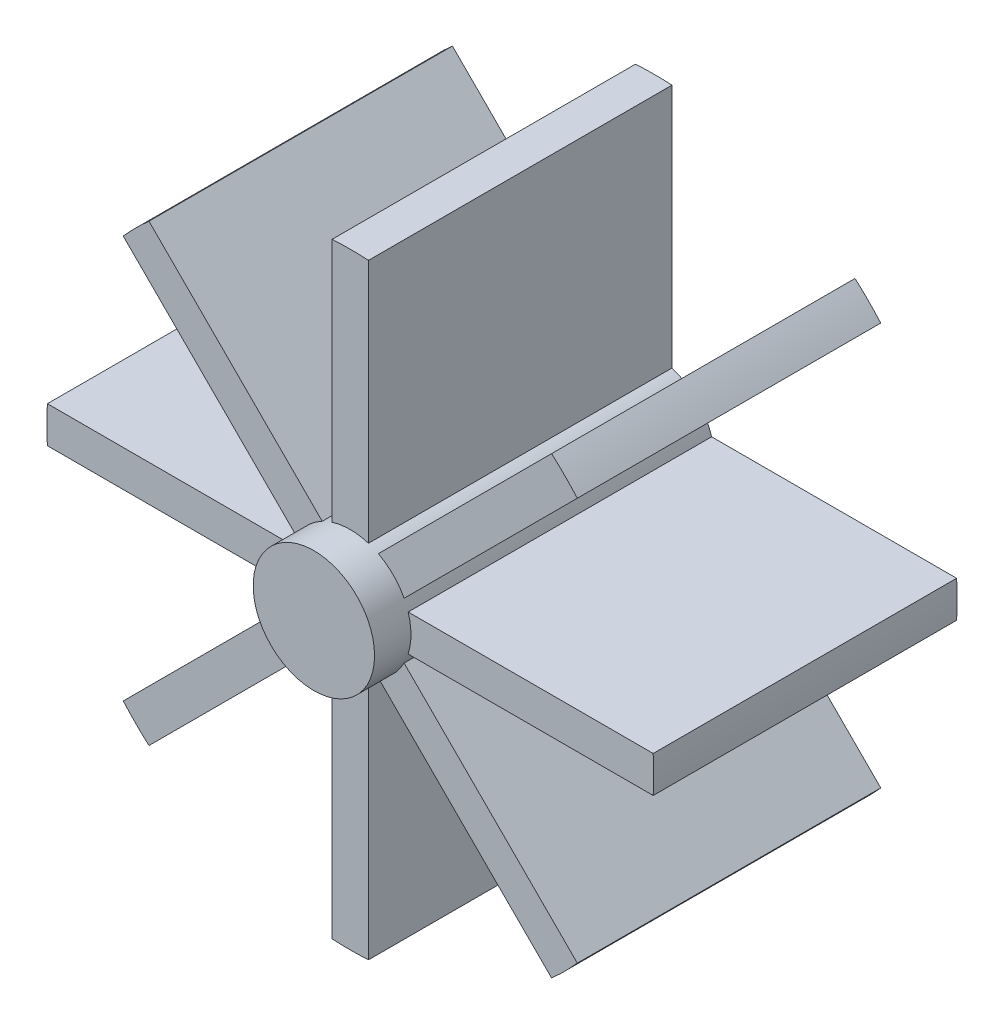
ISO-10303-21;
HEADER;
FILE_DESCRIPTION(('STEP AP214'),'2;1');
FILE_NAME('part.step','',(''),(''),'','','');
FILE_SCHEMA(('AUTOMOTIVE_DESIGN { 1 0 10303 214 1 1 1 1 }'));
ENDSEC;
DATA;
#1=APPLICATION_CONTEXT('core data for automotive mechanical design processes');
#2=APPLICATION_PROTOCOL_DEFINITION('international standard','automotive_design',2000,#1);
#3=PRODUCT_CONTEXT('',#1,'mechanical');
#4=PRODUCT('Part','Part','',(#3));
#5=PRODUCT_RELATED_PRODUCT_CATEGORY('part','',(#4));
#6=PRODUCT_DEFINITION_FORMATION('','',#4);
#7=PRODUCT_DEFINITION_CONTEXT('part definition',#1,'design');
#8=PRODUCT_DEFINITION('design','',#6,#7);
#9=PRODUCT_DEFINITION_SHAPE('','',#8);
#10=(LENGTH_UNIT() NAMED_UNIT(*) SI_UNIT(.MILLI.,.METRE.));
#11=(NAMED_UNIT(*) PLANE_ANGLE_UNIT() SI_UNIT($,.RADIAN.));
#12=(NAMED_UNIT(*) SI_UNIT($,.STERADIAN.) SOLID_ANGLE_UNIT());
#13=UNCERTAINTY_MEASURE_WITH_UNIT(LENGTH_MEASURE(1.E-05),#10,'distance_accuracy_value','');
#14=(GEOMETRIC_REPRESENTATION_CONTEXT(3) GLOBAL_UNCERTAINTY_ASSIGNED_CONTEXT((#13)) GLOBAL_UNIT_ASSIGNED_CONTEXT((#10,
#11,#12)) REPRESENTATION_CONTEXT('',''));
#15=CARTESIAN_POINT('',(0.,0.,0.));
#16=DIRECTION('',(0.,0.,1.));
#17=DIRECTION('',(1.,0.,0.));
#18=AXIS2_PLACEMENT_3D('',#15,#16,#17);
#19=CARTESIAN_POINT('',(0.,0.,50.));
#20=DIRECTION('',(0.,0.,1.));
#21=DIRECTION('',(1.,0.,0.));
#22=AXIS2_PLACEMENT_3D('',#19,#20,#21);
#23=PLANE('',#22);
#24=CARTESIAN_POINT('',(0.,0.,50.));
#25=DIRECTION('',(0.,0.,1.));
#26=DIRECTION('',(1.,0.,0.));
#27=AXIS2_PLACEMENT_3D('',#24,#25,#26);
#28=CIRCLE('',#27,10.);
#29=CARTESIAN_POINT('',(8.86668912517567,4.62404843805638,50.));
#30=VERTEX_POINT('',#29);
#31=CARTESIAN_POINT('',(4.62404843805638,8.86668912517567,50.));
#32=VERTEX_POINT('',#31);
#33=EDGE_CURVE('E11',#30,#32,#28,.T.);
#34=ORIENTED_EDGE('',*,*,#33,.F.);
#35=DIRECTION('',(0.707106781186548,0.707106781186548,0.));
#36=VECTOR('',#35,1.);
#37=CARTESIAN_POINT('',(2.12132034355964,-2.12132034355964,50.));
#38=LINE('',#37,#36);
#39=CARTESIAN_POINT('',(37.4129624136022,33.170321726483,50.));
#40=VERTEX_POINT('',#39);
#41=EDGE_CURVE('E266',#30,#40,#38,.T.);
#42=ORIENTED_EDGE('',*,*,#41,.T.);
#43=CARTESIAN_POINT('',(0.,0.,50.));
#44=DIRECTION('',(0.,0.,1.));
#45=DIRECTION('',(1.,0.,0.));
#46=AXIS2_PLACEMENT_3D('',#43,#44,#45);
#47=CIRCLE('',#46,50.);
#48=CARTESIAN_POINT('',(33.170321726483,37.4129624136022,50.));
#49=VERTEX_POINT('',#48);
#50=EDGE_CURVE('E269',#40,#49,#47,.T.);
#51=ORIENTED_EDGE('',*,*,#50,.T.);
#52=DIRECTION('',(0.707106781186548,0.707106781186547,0.));
#53=VECTOR('',#52,1.);
#54=CARTESIAN_POINT('',(-2.12132034355965,2.12132034355965,50.));
#55=LINE('',#54,#53);
#56=EDGE_CURVE('E334',#32,#49,#55,.T.);
#57=ORIENTED_EDGE('',*,*,#56,.F.);
#58=EDGE_LOOP('',(#34,#42,#51,#57));
#59=FACE_BOUND('',#58,.T.);
#60=ADVANCED_FACE('F32',(#59),#23,.T.);
#61=CARTESIAN_POINT('',(3.,9.53939201416946,50.));
#62=VERTEX_POINT('',#61);
#63=CARTESIAN_POINT('',(-3.,9.53939201416946,50.));
#64=VERTEX_POINT('',#63);
#65=EDGE_CURVE('E41',#62,#64,#28,.T.);
#66=ORIENTED_EDGE('',*,*,#65,.F.);
#67=DIRECTION('',(0.,-1.,0.));
#68=VECTOR('',#67,1.);
#69=CARTESIAN_POINT('',(3.,0.,50.));
#70=LINE('',#69,#68);
#71=CARTESIAN_POINT('',(3.,49.9099188538711,50.));
#72=VERTEX_POINT('',#71);
#73=EDGE_CURVE('E338',#72,#62,#70,.T.);
#74=ORIENTED_EDGE('',*,*,#73,.F.);
#75=CARTESIAN_POINT('',(-3.,49.9099188538711,50.));
#76=VERTEX_POINT('',#75);
#77=EDGE_CURVE('E336',#72,#76,#47,.T.);
#78=ORIENTED_EDGE('',*,*,#77,.T.);
#79=DIRECTION('',(0.,-1.,0.));
#80=VECTOR('',#79,1.);
#81=CARTESIAN_POINT('',(-3.,0.,50.));
#82=LINE('',#81,#80);
#83=EDGE_CURVE('E341',#76,#64,#82,.T.);
#84=ORIENTED_EDGE('',*,*,#83,.T.);
#85=EDGE_LOOP('',(#66,#74,#78,#84));
#86=FACE_BOUND('',#85,.T.);
#87=ADVANCED_FACE('F492',(#86),#23,.T.);
#88=CARTESIAN_POINT('',(-4.62404843805638,8.86668912517566,50.));
#89=VERTEX_POINT('',#88);
#90=CARTESIAN_POINT('',(-8.86668912517567,4.62404843805637,50.));
#91=VERTEX_POINT('',#90);
#92=EDGE_CURVE('E601',#89,#91,#28,.T.);
#93=ORIENTED_EDGE('',*,*,#92,.F.);
#94=DIRECTION('',(-0.707106781186548,0.707106781186548,0.));
#95=VECTOR('',#94,1.);
#96=CARTESIAN_POINT('',(2.12132034355964,2.12132034355964,50.));
#97=LINE('',#96,#95);
#98=CARTESIAN_POINT('',(-33.170321726483,37.4129624136022,50.));
#99=VERTEX_POINT('',#98);
#100=EDGE_CURVE('E344',#89,#99,#97,.T.);
#101=ORIENTED_EDGE('',*,*,#100,.T.);
#102=CARTESIAN_POINT('',(-37.4129624136022,33.1703217264829,50.));
#103=VERTEX_POINT('',#102);
#104=EDGE_CURVE('E346',#99,#103,#47,.T.);
#105=ORIENTED_EDGE('',*,*,#104,.T.);
#106=DIRECTION('',(-0.707106781186547,0.707106781186548,0.));
#107=VECTOR('',#106,1.);
#108=CARTESIAN_POINT('',(-2.12132034355965,-2.12132034355965,50.));
#109=LINE('',#108,#107);
#110=EDGE_CURVE('E347',#91,#103,#109,.T.);
#111=ORIENTED_EDGE('',*,*,#110,.F.);
#112=EDGE_LOOP('',(#93,#101,#105,#111));
#113=FACE_BOUND('',#112,.T.);
#114=ADVANCED_FACE('F497',(#113),#23,.T.);
#115=CARTESIAN_POINT('',(-9.53939201416945,3.00000000000002,50.));
#116=VERTEX_POINT('',#115);
#117=CARTESIAN_POINT('',(-9.53939201416946,-3.,50.));
#118=VERTEX_POINT('',#117);
#119=EDGE_CURVE('E603',#116,#118,#28,.T.);
#120=ORIENTED_EDGE('',*,*,#119,.F.);
#121=DIRECTION('',(1.,0.,0.));
#122=VECTOR('',#121,1.);
#123=CARTESIAN_POINT('',(0.,3.00000000000002,50.));
#124=LINE('',#123,#122);
#125=CARTESIAN_POINT('',(-49.9099188538711,3.,50.));
#126=VERTEX_POINT('',#125);
#127=EDGE_CURVE('E349',#126,#116,#124,.T.);
#128=ORIENTED_EDGE('',*,*,#127,.F.);
#129=CARTESIAN_POINT('',(-49.9099188538711,-3.,50.));
#130=VERTEX_POINT('',#129);
#131=EDGE_CURVE('E352',#126,#130,#47,.T.);
#132=ORIENTED_EDGE('',*,*,#131,.T.);
#133=DIRECTION('',(1.,0.,0.));
#134=VECTOR('',#133,1.);
#135=CARTESIAN_POINT('',(0.,-3.,50.));
#136=LINE('',#135,#134);
#137=EDGE_CURVE('E353',#130,#118,#136,.T.);
#138=ORIENTED_EDGE('',*,*,#137,.T.);
#139=EDGE_LOOP('',(#120,#128,#132,#138));
#140=FACE_BOUND('',#139,.T.);
#141=ADVANCED_FACE('F645',(#140),#23,.T.);
#142=CARTESIAN_POINT('',(-8.86668912517566,-4.62404843805638,50.));
#143=VERTEX_POINT('',#142);
#144=CARTESIAN_POINT('',(-4.62404843805638,-8.86668912517566,50.));
#145=VERTEX_POINT('',#144);
#146=EDGE_CURVE('E606',#143,#145,#28,.T.);
#147=ORIENTED_EDGE('',*,*,#146,.F.);
#148=DIRECTION('',(-0.707106781186548,-0.707106781186548,0.));
#149=VECTOR('',#148,1.);
#150=CARTESIAN_POINT('',(-2.12132034355964,2.12132034355964,50.));
#151=LINE('',#150,#149);
#152=CARTESIAN_POINT('',(-37.4129624136022,-33.170321726483,50.));
#153=VERTEX_POINT('',#152);
#154=EDGE_CURVE('E356',#143,#153,#151,.T.);
#155=ORIENTED_EDGE('',*,*,#154,.T.);
#156=CARTESIAN_POINT('',(-33.170321726483,-37.4129624136022,50.));
#157=VERTEX_POINT('',#156);
#158=EDGE_CURVE('E358',#153,#157,#47,.T.);
#159=ORIENTED_EDGE('',*,*,#158,.T.);
#160=DIRECTION('',(-0.707106781186548,-0.707106781186548,0.));
#161=VECTOR('',#160,1.);
#162=CARTESIAN_POINT('',(2.12132034355964,-2.12132034355964,50.));
#163=LINE('',#162,#161);
#164=EDGE_CURVE('E359',#145,#157,#163,.T.);
#165=ORIENTED_EDGE('',*,*,#164,.F.);
#166=EDGE_LOOP('',(#147,#155,#159,#165));
#167=FACE_BOUND('',#166,.T.);
#168=ADVANCED_FACE('F516',(#167),#23,.T.);
#169=CARTESIAN_POINT('',(-3.,-9.53939201416945,50.));
#170=VERTEX_POINT('',#169);
#171=CARTESIAN_POINT('',(3.,-9.53939201416946,50.));
#172=VERTEX_POINT('',#171);
#173=EDGE_CURVE('E327',#170,#172,#28,.T.);
#174=ORIENTED_EDGE('',*,*,#173,.F.);
#175=DIRECTION('',(0.,-1.,0.));
#176=VECTOR('',#175,1.);
#177=CARTESIAN_POINT('',(-3.00000000000001,0.,50.));
#178=LINE('',#177,#176);
#179=CARTESIAN_POINT('',(-3.,-49.9099188538711,50.));
#180=VERTEX_POINT('',#179);
#181=EDGE_CURVE('E361',#170,#180,#178,.T.);
#182=ORIENTED_EDGE('',*,*,#181,.T.);
#183=CARTESIAN_POINT('',(3.,-49.9099188538711,50.));
#184=VERTEX_POINT('',#183);
#185=EDGE_CURVE('E363',#180,#184,#47,.T.);
#186=ORIENTED_EDGE('',*,*,#185,.T.);
#187=DIRECTION('',(0.,-1.,0.));
#188=VECTOR('',#187,1.);
#189=CARTESIAN_POINT('',(3.,0.,50.));
#190=LINE('',#189,#188);
#191=EDGE_CURVE('E364',#172,#184,#190,.T.);
#192=ORIENTED_EDGE('',*,*,#191,.F.);
#193=EDGE_LOOP('',(#174,#182,#186,#192));
#194=FACE_BOUND('',#193,.T.);
#195=ADVANCED_FACE('F509',(#194),#23,.T.);
#196=CARTESIAN_POINT('',(4.62404843805638,-8.86668912517567,50.));
#197=VERTEX_POINT('',#196);
#198=CARTESIAN_POINT('',(8.86668912517566,-4.62404843805638,50.));
#199=VERTEX_POINT('',#198);
#200=EDGE_CURVE('E326',#197,#199,#28,.T.);
#201=ORIENTED_EDGE('',*,*,#200,.F.);
#202=DIRECTION('',(0.707106781186548,-0.707106781186548,0.));
#203=VECTOR('',#202,1.);
#204=CARTESIAN_POINT('',(-2.12132034355964,-2.12132034355964,50.));
#205=LINE('',#204,#203);
#206=CARTESIAN_POINT('',(33.170321726483,-37.4129624136022,50.));
#207=VERTEX_POINT('',#206);
#208=EDGE_CURVE('E366',#197,#207,#205,.T.);
#209=ORIENTED_EDGE('',*,*,#208,.T.);
#210=CARTESIAN_POINT('',(37.4129624136022,-33.170321726483,50.));
#211=VERTEX_POINT('',#210);
#212=EDGE_CURVE('E368',#207,#211,#47,.T.);
#213=ORIENTED_EDGE('',*,*,#212,.T.);
#214=DIRECTION('',(0.707106781186548,-0.707106781186548,0.));
#215=VECTOR('',#214,1.);
#216=CARTESIAN_POINT('',(2.12132034355964,2.12132034355964,50.));
#217=LINE('',#216,#215);
#218=EDGE_CURVE('E369',#199,#211,#217,.T.);
#219=ORIENTED_EDGE('',*,*,#218,.F.);
#220=EDGE_LOOP('',(#201,#209,#213,#219));
#221=FACE_BOUND('',#220,.T.);
#222=ADVANCED_FACE('F502',(#221),#23,.T.);
#223=CARTESIAN_POINT('',(2.12132034355964,-2.12132034355964,50.));
#224=DIRECTION('',(-0.707106781186548,0.707106781186548,0.));
#225=DIRECTION('',(-0.707106781186548,-0.707106781186548,0.));
#226=AXIS2_PLACEMENT_3D('',#223,#224,#225);
#227=PLANE('',#226);
#228=ORIENTED_EDGE('',*,*,#41,.F.);
#229=DIRECTION('',(0.,0.,1.));
#230=VECTOR('',#229,1.);
#231=CARTESIAN_POINT('',(8.86668912517567,4.62404843805638,0.));
#232=LINE('',#231,#230);
#233=CARTESIAN_POINT('',(8.86668912517566,4.62404843805638,0.));
#234=VERTEX_POINT('',#233);
#235=EDGE_CURVE('E473',#30,#234,#232,.F.);
#236=ORIENTED_EDGE('',*,*,#235,.T.);
#237=DIRECTION('',(0.707106781186548,0.707106781186548,0.));
#238=VECTOR('',#237,1.);
#239=CARTESIAN_POINT('',(2.12132034355964,-2.12132034355964,0.));
#240=LINE('',#239,#238);
#241=CARTESIAN_POINT('',(37.4129624136022,33.170321726483,0.));
#242=VERTEX_POINT('',#241);
#243=EDGE_CURVE('E258',#234,#242,#240,.T.);
#244=ORIENTED_EDGE('',*,*,#243,.T.);
#245=DIRECTION('',(0.,0.,-1.));
#246=VECTOR('',#245,1.);
#247=CARTESIAN_POINT('',(37.4129624136022,33.170321726483,50.));
#248=LINE('',#247,#246);
#249=EDGE_CURVE('E36',#40,#242,#248,.T.);
#250=ORIENTED_EDGE('',*,*,#249,.F.);
#251=EDGE_LOOP('',(#228,#236,#244,#250));
#252=FACE_BOUND('',#251,.T.);
#253=ADVANCED_FACE('F34',(#252),#227,.F.);
#254=CARTESIAN_POINT('',(0.,0.,50.));
#255=DIRECTION('',(0.,0.,-1.));
#256=DIRECTION('',(-1.,0.,0.));
#257=AXIS2_PLACEMENT_3D('',#254,#255,#256);
#258=CYLINDRICAL_SURFACE('',#257,50.);
#259=CARTESIAN_POINT('',(0.,0.,0.));
#260=DIRECTION('',(0.,0.,1.));
#261=DIRECTION('',(1.,0.,0.));
#262=AXIS2_PLACEMENT_3D('',#259,#260,#261);
#263=CIRCLE('',#262,50.);
#264=CARTESIAN_POINT('',(33.170321726483,37.4129624136022,0.));
#265=VERTEX_POINT('',#264);
#266=EDGE_CURVE('E274',#242,#265,#263,.T.);
#267=ORIENTED_EDGE('',*,*,#266,.T.);
#268=DIRECTION('',(0.,0.,-1.));
#269=VECTOR('',#268,1.);
#270=CARTESIAN_POINT('',(33.170321726483,37.4129624136022,50.));
#271=LINE('',#270,#269);
#272=EDGE_CURVE('E316',#49,#265,#271,.T.);
#273=ORIENTED_EDGE('',*,*,#272,.F.);
#274=ORIENTED_EDGE('',*,*,#50,.F.);
#275=ORIENTED_EDGE('',*,*,#249,.T.);
#276=EDGE_LOOP('',(#267,#273,#274,#275));
#277=FACE_BOUND('',#276,.T.);
#278=ADVANCED_FACE('F515',(#277),#258,.T.);
#279=CARTESIAN_POINT('',(-2.12132034355965,2.12132034355965,50.));
#280=DIRECTION('',(-0.707106781186547,0.707106781186548,0.));
#281=DIRECTION('',(-0.707106781186548,-0.707106781186547,0.));
#282=AXIS2_PLACEMENT_3D('',#279,#280,#281);
#283=PLANE('',#282);
#284=DIRECTION('',(0.,0.,1.));
#285=VECTOR('',#284,1.);
#286=CARTESIAN_POINT('',(4.62404843805638,8.86668912517567,0.));
#287=LINE('',#286,#285);
#288=CARTESIAN_POINT('',(4.62404843805638,8.86668912517567,0.));
#289=VERTEX_POINT('',#288);
#290=EDGE_CURVE('E472',#32,#289,#287,.F.);
#291=ORIENTED_EDGE('',*,*,#290,.F.);
#292=ORIENTED_EDGE('',*,*,#56,.T.);
#293=ORIENTED_EDGE('',*,*,#272,.T.);
#294=DIRECTION('',(0.707106781186548,0.707106781186547,0.));
#295=VECTOR('',#294,1.);
#296=CARTESIAN_POINT('',(-2.12132034355965,2.12132034355965,0.));
#297=LINE('',#296,#295);
#298=EDGE_CURVE('E375',#289,#265,#297,.T.);
#299=ORIENTED_EDGE('',*,*,#298,.F.);
#300=EDGE_LOOP('',(#291,#292,#293,#299));
#301=FACE_BOUND('',#300,.T.);
#302=ADVANCED_FACE('F589',(#301),#283,.T.);
#303=CARTESIAN_POINT('',(3.,0.,50.));
#304=DIRECTION('',(1.,0.,0.));
#305=DIRECTION('',(0.,1.,0.));
#306=AXIS2_PLACEMENT_3D('',#303,#304,#305);
#307=PLANE('',#306);
#308=DIRECTION('',(0.,0.,1.));
#309=VECTOR('',#308,1.);
#310=CARTESIAN_POINT('',(3.,9.53939201416946,0.));
#311=LINE('',#310,#309);
#312=CARTESIAN_POINT('',(3.,9.53939201416946,0.));
#313=VERTEX_POINT('',#312);
#314=EDGE_CURVE('E470',#313,#62,#311,.T.);
#315=ORIENTED_EDGE('',*,*,#314,.F.);
#316=DIRECTION('',(0.,-1.,0.));
#317=VECTOR('',#316,1.);
#318=CARTESIAN_POINT('',(3.,0.,0.));
#319=LINE('',#318,#317);
#320=CARTESIAN_POINT('',(3.,49.9099188538711,0.));
#321=VERTEX_POINT('',#320);
#322=EDGE_CURVE('E378',#321,#313,#319,.T.);
#323=ORIENTED_EDGE('',*,*,#322,.F.);
#324=DIRECTION('',(0.,0.,-1.));
#325=VECTOR('',#324,1.);
#326=CARTESIAN_POINT('',(3.,49.9099188538711,50.));
#327=LINE('',#326,#325);
#328=EDGE_CURVE('E315',#72,#321,#327,.T.);
#329=ORIENTED_EDGE('',*,*,#328,.F.);
#330=ORIENTED_EDGE('',*,*,#73,.T.);
#331=EDGE_LOOP('',(#315,#323,#329,#330));
#332=FACE_BOUND('',#331,.T.);
#333=ADVANCED_FACE('F587',(#332),#307,.T.);
#334=CARTESIAN_POINT('',(-3.,49.9099188538711,0.));
#335=VERTEX_POINT('',#334);
#336=EDGE_CURVE('E376',#321,#335,#263,.T.);
#337=ORIENTED_EDGE('',*,*,#336,.T.);
#338=DIRECTION('',(0.,0.,-1.));
#339=VECTOR('',#338,1.);
#340=CARTESIAN_POINT('',(-3.,49.9099188538711,50.));
#341=LINE('',#340,#339);
#342=EDGE_CURVE('E312',#76,#335,#341,.T.);
#343=ORIENTED_EDGE('',*,*,#342,.F.);
#344=ORIENTED_EDGE('',*,*,#77,.F.);
#345=ORIENTED_EDGE('',*,*,#328,.T.);
#346=EDGE_LOOP('',(#337,#343,#344,#345));
#347=FACE_BOUND('',#346,.T.);
#348=ADVANCED_FACE('F432',(#347),#258,.T.);
#349=CARTESIAN_POINT('',(-3.,0.,50.));
#350=DIRECTION('',(1.,0.,0.));
#351=DIRECTION('',(0.,0.,-1.));
#352=AXIS2_PLACEMENT_3D('',#349,#350,#351);
#353=PLANE('',#352);
#354=DIRECTION('',(0.,-1.,0.));
#355=VECTOR('',#354,1.);
#356=CARTESIAN_POINT('',(-3.,0.,0.));
#357=LINE('',#356,#355);
#358=CARTESIAN_POINT('',(-3.,9.53939201416946,0.));
#359=VERTEX_POINT('',#358);
#360=EDGE_CURVE('E381',#335,#359,#357,.T.);
#361=ORIENTED_EDGE('',*,*,#360,.T.);
#362=DIRECTION('',(0.,0.,1.));
#363=VECTOR('',#362,1.);
#364=CARTESIAN_POINT('',(-3.,9.53939201416946,0.));
#365=LINE('',#364,#363);
#366=EDGE_CURVE('E468',#359,#64,#365,.T.);
#367=ORIENTED_EDGE('',*,*,#366,.T.);
#368=ORIENTED_EDGE('',*,*,#83,.F.);
#369=ORIENTED_EDGE('',*,*,#342,.T.);
#370=EDGE_LOOP('',(#361,#367,#368,#369));
#371=FACE_BOUND('',#370,.T.);
#372=ADVANCED_FACE('F438',(#371),#353,.F.);
#373=CARTESIAN_POINT('',(2.12132034355964,2.12132034355964,50.));
#374=DIRECTION('',(-0.707106781186548,-0.707106781186548,0.));
#375=DIRECTION('',(0.707106781186548,-0.707106781186548,0.));
#376=AXIS2_PLACEMENT_3D('',#373,#374,#375);
#377=PLANE('',#376);
#378=ORIENTED_EDGE('',*,*,#100,.F.);
#379=DIRECTION('',(0.,0.,1.));
#380=VECTOR('',#379,1.);
#381=CARTESIAN_POINT('',(-4.62404843805638,8.86668912517566,0.));
#382=LINE('',#381,#380);
#383=CARTESIAN_POINT('',(-4.62404843805638,8.86668912517566,0.));
#384=VERTEX_POINT('',#383);
#385=EDGE_CURVE('E466',#89,#384,#382,.F.);
#386=ORIENTED_EDGE('',*,*,#385,.T.);
#387=DIRECTION('',(-0.707106781186548,0.707106781186548,0.));
#388=VECTOR('',#387,1.);
#389=CARTESIAN_POINT('',(2.12132034355964,2.12132034355964,0.));
#390=LINE('',#389,#388);
#391=CARTESIAN_POINT('',(-33.170321726483,37.4129624136022,0.));
#392=VERTEX_POINT('',#391);
#393=EDGE_CURVE('E384',#384,#392,#390,.T.);
#394=ORIENTED_EDGE('',*,*,#393,.T.);
#395=DIRECTION('',(0.,0.,-1.));
#396=VECTOR('',#395,1.);
#397=CARTESIAN_POINT('',(-33.170321726483,37.4129624136022,50.));
#398=LINE('',#397,#396);
#399=EDGE_CURVE('E309',#99,#392,#398,.T.);
#400=ORIENTED_EDGE('',*,*,#399,.F.);
#401=EDGE_LOOP('',(#378,#386,#394,#400));
#402=FACE_BOUND('',#401,.T.);
#403=ADVANCED_FACE('F581',(#402),#377,.F.);
#404=CARTESIAN_POINT('',(-37.4129624136022,33.1703217264829,0.));
#405=VERTEX_POINT('',#404);
#406=EDGE_CURVE('E386',#392,#405,#263,.T.);
#407=ORIENTED_EDGE('',*,*,#406,.T.);
#408=DIRECTION('',(0.,0.,-1.));
#409=VECTOR('',#408,1.);
#410=CARTESIAN_POINT('',(-37.4129624136022,33.1703217264829,50.));
#411=LINE('',#410,#409);
#412=EDGE_CURVE('E306',#103,#405,#411,.T.);
#413=ORIENTED_EDGE('',*,*,#412,.F.);
#414=ORIENTED_EDGE('',*,*,#104,.F.);
#415=ORIENTED_EDGE('',*,*,#399,.T.);
#416=EDGE_LOOP('',(#407,#413,#414,#415));
#417=FACE_BOUND('',#416,.T.);
#418=ADVANCED_FACE('F579',(#417),#258,.T.);
#419=CARTESIAN_POINT('',(-2.12132034355965,-2.12132034355965,50.));
#420=DIRECTION('',(-0.707106781186548,-0.707106781186547,0.));
#421=DIRECTION('',(0.707106781186547,-0.707106781186548,0.));
#422=AXIS2_PLACEMENT_3D('',#419,#420,#421);
#423=PLANE('',#422);
#424=DIRECTION('',(0.,0.,1.));
#425=VECTOR('',#424,1.);
#426=CARTESIAN_POINT('',(-8.86668912517567,4.62404843805638,0.));
#427=LINE('',#426,#425);
#428=CARTESIAN_POINT('',(-8.86668912517567,4.62404843805637,0.));
#429=VERTEX_POINT('',#428);
#430=EDGE_CURVE('E464',#91,#429,#427,.F.);
#431=ORIENTED_EDGE('',*,*,#430,.F.);
#432=ORIENTED_EDGE('',*,*,#110,.T.);
#433=ORIENTED_EDGE('',*,*,#412,.T.);
#434=DIRECTION('',(-0.707106781186547,0.707106781186548,0.));
#435=VECTOR('',#434,1.);
#436=CARTESIAN_POINT('',(-2.12132034355965,-2.12132034355965,0.));
#437=LINE('',#436,#435);
#438=EDGE_CURVE('E387',#429,#405,#437,.T.);
#439=ORIENTED_EDGE('',*,*,#438,.F.);
#440=EDGE_LOOP('',(#431,#432,#433,#439));
#441=FACE_BOUND('',#440,.T.);
#442=ADVANCED_FACE('F575',(#441),#423,.T.);
#443=CARTESIAN_POINT('',(0.,3.00000000000002,50.));
#444=DIRECTION('',(0.,1.,0.));
#445=DIRECTION('',(-1.,0.,0.));
#446=AXIS2_PLACEMENT_3D('',#443,#444,#445);
#447=PLANE('',#446);
#448=DIRECTION('',(0.,0.,1.));
#449=VECTOR('',#448,1.);
#450=CARTESIAN_POINT('',(-9.53939201416945,3.00000000000002,0.));
#451=LINE('',#450,#449);
#452=CARTESIAN_POINT('',(-9.53939201416945,3.00000000000002,0.));
#453=VERTEX_POINT('',#452);
#454=EDGE_CURVE('E462',#453,#116,#451,.T.);
#455=ORIENTED_EDGE('',*,*,#454,.F.);
#456=DIRECTION('',(1.,0.,0.));
#457=VECTOR('',#456,1.);
#458=CARTESIAN_POINT('',(0.,3.00000000000002,0.));
#459=LINE('',#458,#457);
#460=CARTESIAN_POINT('',(-49.9099188538711,3.,0.));
#461=VERTEX_POINT('',#460);
#462=EDGE_CURVE('E389',#461,#453,#459,.T.);
#463=ORIENTED_EDGE('',*,*,#462,.F.);
#464=DIRECTION('',(0.,0.,-1.));
#465=VECTOR('',#464,1.);
#466=CARTESIAN_POINT('',(-49.9099188538711,3.,50.));
#467=LINE('',#466,#465);
#468=EDGE_CURVE('E304',#126,#461,#467,.T.);
#469=ORIENTED_EDGE('',*,*,#468,.F.);
#470=ORIENTED_EDGE('',*,*,#127,.T.);
#471=EDGE_LOOP('',(#455,#463,#469,#470));
#472=FACE_BOUND('',#471,.T.);
#473=ADVANCED_FACE('F572',(#472),#447,.T.);
#474=CARTESIAN_POINT('',(-49.9099188538711,-3.,0.));
#475=VERTEX_POINT('',#474);
#476=EDGE_CURVE('E392',#461,#475,#263,.T.);
#477=ORIENTED_EDGE('',*,*,#476,.T.);
#478=DIRECTION('',(0.,0.,-1.));
#479=VECTOR('',#478,1.);
#480=CARTESIAN_POINT('',(-49.9099188538711,-3.,50.));
#481=LINE('',#480,#479);
#482=EDGE_CURVE('E301',#130,#475,#481,.T.);
#483=ORIENTED_EDGE('',*,*,#482,.F.);
#484=ORIENTED_EDGE('',*,*,#131,.F.);
#485=ORIENTED_EDGE('',*,*,#468,.T.);
#486=EDGE_LOOP('',(#477,#483,#484,#485));
#487=FACE_BOUND('',#486,.T.);
#488=ADVANCED_FACE('F570',(#487),#258,.T.);
#489=CARTESIAN_POINT('',(0.,-3.,50.));
#490=DIRECTION('',(0.,1.,0.));
#491=DIRECTION('',(-1.,0.,0.));
#492=AXIS2_PLACEMENT_3D('',#489,#490,#491);
#493=PLANE('',#492);
#494=DIRECTION('',(1.,0.,0.));
#495=VECTOR('',#494,1.);
#496=CARTESIAN_POINT('',(0.,-3.,0.));
#497=LINE('',#496,#495);
#498=CARTESIAN_POINT('',(-9.53939201416946,-3.,0.));
#499=VERTEX_POINT('',#498);
#500=EDGE_CURVE('E393',#475,#499,#497,.T.);
#501=ORIENTED_EDGE('',*,*,#500,.T.);
#502=DIRECTION('',(0.,0.,1.));
#503=VECTOR('',#502,1.);
#504=CARTESIAN_POINT('',(-9.53939201416946,-3.,0.));
#505=LINE('',#504,#503);
#506=EDGE_CURVE('E460',#499,#118,#505,.T.);
#507=ORIENTED_EDGE('',*,*,#506,.T.);
#508=ORIENTED_EDGE('',*,*,#137,.F.);
#509=ORIENTED_EDGE('',*,*,#482,.T.);
#510=EDGE_LOOP('',(#501,#507,#508,#509));
#511=FACE_BOUND('',#510,.T.);
#512=ADVANCED_FACE('F566',(#511),#493,.F.);
#513=CARTESIAN_POINT('',(-2.12132034355964,2.12132034355964,50.));
#514=DIRECTION('',(0.707106781186548,-0.707106781186548,0.));
#515=DIRECTION('',(0.707106781186548,0.707106781186548,0.));
#516=AXIS2_PLACEMENT_3D('',#513,#514,#515);
#517=PLANE('',#516);
#518=ORIENTED_EDGE('',*,*,#154,.F.);
#519=DIRECTION('',(0.,0.,1.));
#520=VECTOR('',#519,1.);
#521=CARTESIAN_POINT('',(-8.86668912517566,-4.62404843805638,0.));
#522=LINE('',#521,#520);
#523=CARTESIAN_POINT('',(-8.86668912517566,-4.62404843805638,0.));
#524=VERTEX_POINT('',#523);
#525=EDGE_CURVE('E457',#143,#524,#522,.F.);
#526=ORIENTED_EDGE('',*,*,#525,.T.);
#527=DIRECTION('',(-0.707106781186548,-0.707106781186548,0.));
#528=VECTOR('',#527,1.);
#529=CARTESIAN_POINT('',(-2.12132034355964,2.12132034355964,0.));
#530=LINE('',#529,#528);
#531=CARTESIAN_POINT('',(-37.4129624136022,-33.170321726483,0.));
#532=VERTEX_POINT('',#531);
#533=EDGE_CURVE('E396',#524,#532,#530,.T.);
#534=ORIENTED_EDGE('',*,*,#533,.T.);
#535=DIRECTION('',(0.,0.,-1.));
#536=VECTOR('',#535,1.);
#537=CARTESIAN_POINT('',(-37.4129624136022,-33.170321726483,50.));
#538=LINE('',#537,#536);
#539=EDGE_CURVE('E298',#153,#532,#538,.T.);
#540=ORIENTED_EDGE('',*,*,#539,.F.);
#541=EDGE_LOOP('',(#518,#526,#534,#540));
#542=FACE_BOUND('',#541,.T.);
#543=ADVANCED_FACE('F563',(#542),#517,.F.);
#544=CARTESIAN_POINT('',(-33.170321726483,-37.4129624136022,0.));
#545=VERTEX_POINT('',#544);
#546=EDGE_CURVE('E398',#532,#545,#263,.T.);
#547=ORIENTED_EDGE('',*,*,#546,.T.);
#548=DIRECTION('',(0.,0.,-1.));
#549=VECTOR('',#548,1.);
#550=CARTESIAN_POINT('',(-33.170321726483,-37.4129624136022,50.));
#551=LINE('',#550,#549);
#552=EDGE_CURVE('E295',#157,#545,#551,.T.);
#553=ORIENTED_EDGE('',*,*,#552,.F.);
#554=ORIENTED_EDGE('',*,*,#158,.F.);
#555=ORIENTED_EDGE('',*,*,#539,.T.);
#556=EDGE_LOOP('',(#547,#553,#554,#555));
#557=FACE_BOUND('',#556,.T.);
#558=ADVANCED_FACE('F561',(#557),#258,.T.);
#559=CARTESIAN_POINT('',(2.12132034355964,-2.12132034355964,50.));
#560=DIRECTION('',(0.707106781186548,-0.707106781186548,0.));
#561=DIRECTION('',(0.707106781186548,0.707106781186548,0.));
#562=AXIS2_PLACEMENT_3D('',#559,#560,#561);
#563=PLANE('',#562);
#564=DIRECTION('',(0.,0.,1.));
#565=VECTOR('',#564,1.);
#566=CARTESIAN_POINT('',(-4.62404843805638,-8.86668912517567,0.));
#567=LINE('',#566,#565);
#568=CARTESIAN_POINT('',(-4.62404843805638,-8.86668912517566,0.));
#569=VERTEX_POINT('',#568);
#570=EDGE_CURVE('E455',#145,#569,#567,.F.);
#571=ORIENTED_EDGE('',*,*,#570,.F.);
#572=ORIENTED_EDGE('',*,*,#164,.T.);
#573=ORIENTED_EDGE('',*,*,#552,.T.);
#574=DIRECTION('',(-0.707106781186548,-0.707106781186548,0.));
#575=VECTOR('',#574,1.);
#576=CARTESIAN_POINT('',(2.12132034355964,-2.12132034355964,0.));
#577=LINE('',#576,#575);
#578=EDGE_CURVE('E399',#569,#545,#577,.T.);
#579=ORIENTED_EDGE('',*,*,#578,.F.);
#580=EDGE_LOOP('',(#571,#572,#573,#579));
#581=FACE_BOUND('',#580,.T.);
#582=ADVANCED_FACE('F557',(#581),#563,.T.);
#583=CARTESIAN_POINT('',(-3.00000000000001,0.,50.));
#584=DIRECTION('',(1.,0.,0.));
#585=DIRECTION('',(0.,1.,0.));
#586=AXIS2_PLACEMENT_3D('',#583,#584,#585);
#587=PLANE('',#586);
#588=ORIENTED_EDGE('',*,*,#181,.F.);
#589=DIRECTION('',(0.,0.,1.));
#590=VECTOR('',#589,1.);
#591=CARTESIAN_POINT('',(-3.,-9.53939201416945,0.));
#592=LINE('',#591,#590);
#593=CARTESIAN_POINT('',(-3.,-9.53939201416945,0.));
#594=VERTEX_POINT('',#593);
#595=EDGE_CURVE('E452',#170,#594,#592,.F.);
#596=ORIENTED_EDGE('',*,*,#595,.T.);
#597=DIRECTION('',(0.,-1.,0.));
#598=VECTOR('',#597,1.);
#599=CARTESIAN_POINT('',(-3.00000000000001,0.,0.));
#600=LINE('',#599,#598);
#601=CARTESIAN_POINT('',(-3.,-49.9099188538711,0.));
#602=VERTEX_POINT('',#601);
#603=EDGE_CURVE('E401',#594,#602,#600,.T.);
#604=ORIENTED_EDGE('',*,*,#603,.T.);
#605=DIRECTION('',(0.,0.,-1.));
#606=VECTOR('',#605,1.);
#607=CARTESIAN_POINT('',(-3.,-49.9099188538711,50.));
#608=LINE('',#607,#606);
#609=EDGE_CURVE('E292',#180,#602,#608,.T.);
#610=ORIENTED_EDGE('',*,*,#609,.F.);
#611=EDGE_LOOP('',(#588,#596,#604,#610));
#612=FACE_BOUND('',#611,.T.);
#613=ADVANCED_FACE('F554',(#612),#587,.F.);
#614=CARTESIAN_POINT('',(3.,-49.9099188538711,0.));
#615=VERTEX_POINT('',#614);
#616=EDGE_CURVE('E403',#602,#615,#263,.T.);
#617=ORIENTED_EDGE('',*,*,#616,.T.);
#618=DIRECTION('',(0.,0.,-1.));
#619=VECTOR('',#618,1.);
#620=CARTESIAN_POINT('',(3.,-49.9099188538711,50.));
#621=LINE('',#620,#619);
#622=EDGE_CURVE('E289',#184,#615,#621,.T.);
#623=ORIENTED_EDGE('',*,*,#622,.F.);
#624=ORIENTED_EDGE('',*,*,#185,.F.);
#625=ORIENTED_EDGE('',*,*,#609,.T.);
#626=EDGE_LOOP('',(#617,#623,#624,#625));
#627=FACE_BOUND('',#626,.T.);
#628=ADVANCED_FACE('F552',(#627),#258,.T.);
#629=CARTESIAN_POINT('',(3.,0.,50.));
#630=DIRECTION('',(1.,0.,0.));
#631=DIRECTION('',(0.,0.,-1.));
#632=AXIS2_PLACEMENT_3D('',#629,#630,#631);
#633=PLANE('',#632);
#634=DIRECTION('',(0.,0.,1.));
#635=VECTOR('',#634,1.);
#636=CARTESIAN_POINT('',(3.,-9.53939201416946,0.));
#637=LINE('',#636,#635);
#638=CARTESIAN_POINT('',(3.,-9.53939201416946,0.));
#639=VERTEX_POINT('',#638);
#640=EDGE_CURVE('E450',#172,#639,#637,.F.);
#641=ORIENTED_EDGE('',*,*,#640,.F.);
#642=ORIENTED_EDGE('',*,*,#191,.T.);
#643=ORIENTED_EDGE('',*,*,#622,.T.);
#644=DIRECTION('',(0.,-1.,0.));
#645=VECTOR('',#644,1.);
#646=CARTESIAN_POINT('',(3.,0.,0.));
#647=LINE('',#646,#645);
#648=EDGE_CURVE('E404',#639,#615,#647,.T.);
#649=ORIENTED_EDGE('',*,*,#648,.F.);
#650=EDGE_LOOP('',(#641,#642,#643,#649));
#651=FACE_BOUND('',#650,.T.);
#652=ADVANCED_FACE('F549',(#651),#633,.T.);
#653=CARTESIAN_POINT('',(-2.12132034355964,-2.12132034355964,50.));
#654=DIRECTION('',(0.707106781186548,0.707106781186548,0.));
#655=DIRECTION('',(-0.707106781186548,0.707106781186548,0.));
#656=AXIS2_PLACEMENT_3D('',#653,#654,#655);
#657=PLANE('',#656);
#658=ORIENTED_EDGE('',*,*,#208,.F.);
#659=DIRECTION('',(0.,0.,1.));
#660=VECTOR('',#659,1.);
#661=CARTESIAN_POINT('',(4.62404843805638,-8.86668912517567,0.));
#662=LINE('',#661,#660);
#663=CARTESIAN_POINT('',(4.62404843805638,-8.86668912517566,0.));
#664=VERTEX_POINT('',#663);
#665=EDGE_CURVE('E57',#197,#664,#662,.F.);
#666=ORIENTED_EDGE('',*,*,#665,.T.);
#667=DIRECTION('',(0.707106781186548,-0.707106781186548,0.));
#668=VECTOR('',#667,1.);
#669=CARTESIAN_POINT('',(-2.12132034355964,-2.12132034355964,0.));
#670=LINE('',#669,#668);
#671=CARTESIAN_POINT('',(33.170321726483,-37.4129624136022,0.));
#672=VERTEX_POINT('',#671);
#673=EDGE_CURVE('E406',#664,#672,#670,.T.);
#674=ORIENTED_EDGE('',*,*,#673,.T.);
#675=DIRECTION('',(0.,0.,-1.));
#676=VECTOR('',#675,1.);
#677=CARTESIAN_POINT('',(33.170321726483,-37.4129624136022,50.));
#678=LINE('',#677,#676);
#679=EDGE_CURVE('E286',#207,#672,#678,.T.);
#680=ORIENTED_EDGE('',*,*,#679,.F.);
#681=EDGE_LOOP('',(#658,#666,#674,#680));
#682=FACE_BOUND('',#681,.T.);
#683=ADVANCED_FACE('F523',(#682),#657,.F.);
#684=CARTESIAN_POINT('',(37.4129624136022,-33.170321726483,0.));
#685=VERTEX_POINT('',#684);
#686=EDGE_CURVE('E273',#672,#685,#263,.T.);
#687=ORIENTED_EDGE('',*,*,#686,.T.);
#688=DIRECTION('',(0.,0.,-1.));
#689=VECTOR('',#688,1.);
#690=CARTESIAN_POINT('',(37.4129624136022,-33.170321726483,50.));
#691=LINE('',#690,#689);
#692=EDGE_CURVE('E283',#211,#685,#691,.T.);
#693=ORIENTED_EDGE('',*,*,#692,.F.);
#694=ORIENTED_EDGE('',*,*,#212,.F.);
#695=ORIENTED_EDGE('',*,*,#679,.T.);
#696=EDGE_LOOP('',(#687,#693,#694,#695));
#697=FACE_BOUND('',#696,.T.);
#698=ADVANCED_FACE('F526',(#697),#258,.T.);
#699=CARTESIAN_POINT('',(2.12132034355964,2.12132034355964,50.));
#700=DIRECTION('',(0.707106781186548,0.707106781186548,0.));
#701=DIRECTION('',(-0.707106781186548,0.707106781186548,0.));
#702=AXIS2_PLACEMENT_3D('',#699,#700,#701);
#703=PLANE('',#702);
#704=DIRECTION('',(0.,0.,1.));
#705=VECTOR('',#704,1.);
#706=CARTESIAN_POINT('',(8.86668912517566,-4.62404843805638,0.));
#707=LINE('',#706,#705);
#708=CARTESIAN_POINT('',(8.86668912517566,-4.62404843805638,0.));
#709=VERTEX_POINT('',#708);
#710=EDGE_CURVE('E447',#199,#709,#707,.F.);
#711=ORIENTED_EDGE('',*,*,#710,.F.);
#712=ORIENTED_EDGE('',*,*,#218,.T.);
#713=ORIENTED_EDGE('',*,*,#692,.T.);
#714=DIRECTION('',(0.707106781186548,-0.707106781186548,0.));
#715=VECTOR('',#714,1.);
#716=CARTESIAN_POINT('',(2.12132034355964,2.12132034355964,0.));
#717=LINE('',#716,#715);
#718=EDGE_CURVE('E407',#709,#685,#717,.T.);
#719=ORIENTED_EDGE('',*,*,#718,.F.);
#720=EDGE_LOOP('',(#711,#712,#713,#719));
#721=FACE_BOUND('',#720,.T.);
#722=ADVANCED_FACE('F537',(#721),#703,.T.);
#723=CARTESIAN_POINT('',(0.,-3.,50.));
#724=DIRECTION('',(0.,1.,0.));
#725=DIRECTION('',(0.,0.,1.));
#726=AXIS2_PLACEMENT_3D('',#723,#724,#725);
#727=PLANE('',#726);
#728=DIRECTION('',(1.,0.,0.));
#729=VECTOR('',#728,1.);
#730=CARTESIAN_POINT('',(0.,-3.,50.));
#731=LINE('',#730,#729);
#732=CARTESIAN_POINT('',(9.53939201416946,-3.,50.));
#733=VERTEX_POINT('',#732);
#734=CARTESIAN_POINT('',(49.9099188538711,-3.,50.));
#735=VERTEX_POINT('',#734);
#736=EDGE_CURVE('E371',#733,#735,#731,.T.);
#737=ORIENTED_EDGE('',*,*,#736,.F.);
#738=DIRECTION('',(0.,0.,1.));
#739=VECTOR('',#738,1.);
#740=CARTESIAN_POINT('',(9.53939201416946,-3.,0.));
#741=LINE('',#740,#739);
#742=CARTESIAN_POINT('',(9.53939201416946,-3.,0.));
#743=VERTEX_POINT('',#742);
#744=EDGE_CURVE('E50',#733,#743,#741,.F.);
#745=ORIENTED_EDGE('',*,*,#744,.T.);
#746=DIRECTION('',(1.,0.,0.));
#747=VECTOR('',#746,1.);
#748=CARTESIAN_POINT('',(0.,-3.,0.));
#749=LINE('',#748,#747);
#750=CARTESIAN_POINT('',(49.9099188538711,-3.,0.));
#751=VERTEX_POINT('',#750);
#752=EDGE_CURVE('E271',#743,#751,#749,.T.);
#753=ORIENTED_EDGE('',*,*,#752,.T.);
#754=DIRECTION('',(0.,0.,-1.));
#755=VECTOR('',#754,1.);
#756=CARTESIAN_POINT('',(49.9099188538711,-3.,50.));
#757=LINE('',#756,#755);
#758=EDGE_CURVE('E279',#735,#751,#757,.T.);
#759=ORIENTED_EDGE('',*,*,#758,.F.);
#760=EDGE_LOOP('',(#737,#745,#753,#759));
#761=FACE_BOUND('',#760,.T.);
#762=ADVANCED_FACE('F535',(#761),#727,.F.);
#763=CARTESIAN_POINT('',(49.9099188538711,3.,0.));
#764=VERTEX_POINT('',#763);
#765=EDGE_CURVE('E267',#751,#764,#263,.T.);
#766=ORIENTED_EDGE('',*,*,#765,.T.);
#767=DIRECTION('',(0.,0.,-1.));
#768=VECTOR('',#767,1.);
#769=CARTESIAN_POINT('',(49.9099188538711,3.,50.));
#770=LINE('',#769,#768);
#771=CARTESIAN_POINT('',(49.9099188538711,3.,50.));
#772=VERTEX_POINT('',#771);
#773=EDGE_CURVE('E264',#772,#764,#770,.T.);
#774=ORIENTED_EDGE('',*,*,#773,.F.);
#775=EDGE_CURVE('E335',#735,#772,#47,.T.);
#776=ORIENTED_EDGE('',*,*,#775,.F.);
#777=ORIENTED_EDGE('',*,*,#758,.T.);
#778=EDGE_LOOP('',(#766,#774,#776,#777));
#779=FACE_BOUND('',#778,.T.);
#780=ADVANCED_FACE('F506',(#779),#258,.T.);
#781=CARTESIAN_POINT('',(0.,3.,50.));
#782=DIRECTION('',(0.,1.,0.));
#783=DIRECTION('',(-1.,0.,0.));
#784=AXIS2_PLACEMENT_3D('',#781,#782,#783);
#785=PLANE('',#784);
#786=DIRECTION('',(0.,0.,1.));
#787=VECTOR('',#786,1.);
#788=CARTESIAN_POINT('',(9.53939201416946,3.,0.));
#789=LINE('',#788,#787);
#790=CARTESIAN_POINT('',(9.53939201416946,3.,50.));
#791=VERTEX_POINT('',#790);
#792=CARTESIAN_POINT('',(9.53939201416946,3.,0.));
#793=VERTEX_POINT('',#792);
#794=EDGE_CURVE('E242',#791,#793,#789,.F.);
#795=ORIENTED_EDGE('',*,*,#794,.F.);
#796=DIRECTION('',(1.,0.,0.));
#797=VECTOR('',#796,1.);
#798=CARTESIAN_POINT('',(0.,3.,50.));
#799=LINE('',#798,#797);
#800=EDGE_CURVE('E280',#791,#772,#799,.T.);
#801=ORIENTED_EDGE('',*,*,#800,.T.);
#802=ORIENTED_EDGE('',*,*,#773,.T.);
#803=DIRECTION('',(1.,0.,0.));
#804=VECTOR('',#803,1.);
#805=CARTESIAN_POINT('',(0.,3.,0.));
#806=LINE('',#805,#804);
#807=EDGE_CURVE('E255',#793,#764,#806,.T.);
#808=ORIENTED_EDGE('',*,*,#807,.F.);
#809=EDGE_LOOP('',(#795,#801,#802,#808));
#810=FACE_BOUND('',#809,.T.);
#811=ADVANCED_FACE('F262',(#810),#785,.T.);
#812=EDGE_CURVE('E43',#733,#791,#28,.T.);
#813=ORIENTED_EDGE('',*,*,#812,.F.);
#814=ORIENTED_EDGE('',*,*,#736,.T.);
#815=ORIENTED_EDGE('',*,*,#775,.T.);
#816=ORIENTED_EDGE('',*,*,#800,.F.);
#817=EDGE_LOOP('',(#813,#814,#815,#816));
#818=FACE_BOUND('',#817,.T.);
#819=ADVANCED_FACE('F488',(#818),#23,.T.);
#820=CARTESIAN_POINT('',(0.,0.,0.));
#821=DIRECTION('',(0.,0.,1.));
#822=DIRECTION('',(1.,0.,0.));
#823=AXIS2_PLACEMENT_3D('',#820,#821,#822);
#824=PLANE('',#823);
#825=ORIENTED_EDGE('',*,*,#243,.F.);
#826=CARTESIAN_POINT('',(0.,0.,0.));
#827=DIRECTION('',(0.,0.,1.));
#828=DIRECTION('',(1.,0.,0.));
#829=AXIS2_PLACEMENT_3D('',#826,#827,#828);
#830=CIRCLE('',#829,10.);
#831=EDGE_CURVE('E245',#793,#234,#830,.T.);
#832=ORIENTED_EDGE('',*,*,#831,.F.);
#833=ORIENTED_EDGE('',*,*,#807,.T.);
#834=ORIENTED_EDGE('',*,*,#765,.F.);
#835=ORIENTED_EDGE('',*,*,#752,.F.);
#836=EDGE_CURVE('E261',#709,#743,#830,.T.);
#837=ORIENTED_EDGE('',*,*,#836,.F.);
#838=ORIENTED_EDGE('',*,*,#718,.T.);
#839=ORIENTED_EDGE('',*,*,#686,.F.);
#840=ORIENTED_EDGE('',*,*,#673,.F.);
#841=EDGE_CURVE('E619',#639,#664,#830,.T.);
#842=ORIENTED_EDGE('',*,*,#841,.F.);
#843=ORIENTED_EDGE('',*,*,#648,.T.);
#844=ORIENTED_EDGE('',*,*,#616,.F.);
#845=ORIENTED_EDGE('',*,*,#603,.F.);
#846=EDGE_CURVE('E620',#569,#594,#830,.T.);
#847=ORIENTED_EDGE('',*,*,#846,.F.);
#848=ORIENTED_EDGE('',*,*,#578,.T.);
#849=ORIENTED_EDGE('',*,*,#546,.F.);
#850=ORIENTED_EDGE('',*,*,#533,.F.);
#851=EDGE_CURVE('E444',#499,#524,#830,.T.);
#852=ORIENTED_EDGE('',*,*,#851,.F.);
#853=ORIENTED_EDGE('',*,*,#500,.F.);
#854=ORIENTED_EDGE('',*,*,#476,.F.);
#855=ORIENTED_EDGE('',*,*,#462,.T.);
#856=EDGE_CURVE('E443',#429,#453,#830,.T.);
#857=ORIENTED_EDGE('',*,*,#856,.F.);
#858=ORIENTED_EDGE('',*,*,#438,.T.);
#859=ORIENTED_EDGE('',*,*,#406,.F.);
#860=ORIENTED_EDGE('',*,*,#393,.F.);
#861=EDGE_CURVE('E441',#359,#384,#830,.T.);
#862=ORIENTED_EDGE('',*,*,#861,.F.);
#863=ORIENTED_EDGE('',*,*,#360,.F.);
#864=ORIENTED_EDGE('',*,*,#336,.F.);
#865=ORIENTED_EDGE('',*,*,#322,.T.);
#866=EDGE_CURVE('E259',#289,#313,#830,.T.);
#867=ORIENTED_EDGE('',*,*,#866,.F.);
#868=ORIENTED_EDGE('',*,*,#298,.T.);
#869=ORIENTED_EDGE('',*,*,#266,.F.);
#870=EDGE_LOOP('',(#825,#832,#833,#834,#835,#837,#838,#839,#840,#842,#843,#844,#845,#847,#848,
#849,#850,#852,#853,#854,#855,#857,#858,#859,#860,#862,#863,#864,#865,#867,#868,#869));
#871=FACE_BOUND('',#870,.T.);
#872=ADVANCED_FACE('F253',(#871),#824,.F.);
#873=CARTESIAN_POINT('',(0.,0.,56.));
#874=DIRECTION('',(0.,0.,-1.));
#875=DIRECTION('',(-1.,0.,0.));
#876=AXIS2_PLACEMENT_3D('',#873,#874,#875);
#877=CYLINDRICAL_SURFACE('',#876,10.);
#878=CARTESIAN_POINT('',(0.,0.,56.));
#879=DIRECTION('',(0.,0.,1.));
#880=DIRECTION('',(1.,0.,0.));
#881=AXIS2_PLACEMENT_3D('',#878,#879,#880);
#882=CIRCLE('',#881,10.);
#883=CARTESIAN_POINT('',(10.,0.,56.));
#884=VERTEX_POINT('',#883);
#885=EDGE_CURVE('E329',#884,#884,#882,.T.);
#886=ORIENTED_EDGE('',*,*,#885,.F.);
#887=EDGE_LOOP('',(#886));
#888=FACE_BOUND('',#887,.T.);
#889=ORIENTED_EDGE('',*,*,#812,.T.);
#890=ORIENTED_EDGE('',*,*,#794,.T.);
#891=ORIENTED_EDGE('',*,*,#831,.T.);
#892=ORIENTED_EDGE('',*,*,#235,.F.);
#893=ORIENTED_EDGE('',*,*,#33,.T.);
#894=ORIENTED_EDGE('',*,*,#290,.T.);
#895=ORIENTED_EDGE('',*,*,#866,.T.);
#896=ORIENTED_EDGE('',*,*,#314,.T.);
#897=ORIENTED_EDGE('',*,*,#65,.T.);
#898=ORIENTED_EDGE('',*,*,#366,.F.);
#899=ORIENTED_EDGE('',*,*,#861,.T.);
#900=ORIENTED_EDGE('',*,*,#385,.F.);
#901=ORIENTED_EDGE('',*,*,#92,.T.);
#902=ORIENTED_EDGE('',*,*,#430,.T.);
#903=ORIENTED_EDGE('',*,*,#856,.T.);
#904=ORIENTED_EDGE('',*,*,#454,.T.);
#905=ORIENTED_EDGE('',*,*,#119,.T.);
#906=ORIENTED_EDGE('',*,*,#506,.F.);
#907=ORIENTED_EDGE('',*,*,#851,.T.);
#908=ORIENTED_EDGE('',*,*,#525,.F.);
#909=ORIENTED_EDGE('',*,*,#146,.T.);
#910=ORIENTED_EDGE('',*,*,#570,.T.);
#911=ORIENTED_EDGE('',*,*,#846,.T.);
#912=ORIENTED_EDGE('',*,*,#595,.F.);
#913=ORIENTED_EDGE('',*,*,#173,.T.);
#914=ORIENTED_EDGE('',*,*,#640,.T.);
#915=ORIENTED_EDGE('',*,*,#841,.T.);
#916=ORIENTED_EDGE('',*,*,#665,.F.);
#917=ORIENTED_EDGE('',*,*,#200,.T.);
#918=ORIENTED_EDGE('',*,*,#710,.T.);
#919=ORIENTED_EDGE('',*,*,#836,.T.);
#920=ORIENTED_EDGE('',*,*,#744,.F.);
#921=EDGE_LOOP('',(#889,#890,#891,#892,#893,#894,#895,#896,#897,#898,#899,#900,#901,#902,#903,
#904,#905,#906,#907,#908,#909,#910,#911,#912,#913,#914,#915,#916,#917,#918,#919,#920));
#922=FACE_BOUND('',#921,.T.);
#923=ADVANCED_FACE('F244',(#888,#922),#877,.T.);
#924=CARTESIAN_POINT('',(0.,0.,56.));
#925=DIRECTION('',(0.,0.,1.));
#926=DIRECTION('',(1.,0.,0.));
#927=AXIS2_PLACEMENT_3D('',#924,#925,#926);
#928=PLANE('',#927);
#929=ORIENTED_EDGE('',*,*,#885,.T.);
#930=EDGE_LOOP('',(#929));
#931=FACE_BOUND('',#930,.T.);
#932=ADVANCED_FACE('F479',(#931),#928,.T.);
#933=CLOSED_SHELL('',(#60,#87,#114,#141,#168,#195,#222,#253,#278,#302,#333,#348,#372,#403,#418,
#442,#473,#488,#512,#543,#558,#582,#613,#628,#652,#683,#698,#722,#762,#780,#811,#819,#872,#923,#932));
#934=MANIFOLD_SOLID_BREP('B2',#933);
#935=ADVANCED_BREP_SHAPE_REPRESENTATION('',(#18,#934),#14);
#936=SHAPE_DEFINITION_REPRESENTATION(#9,#935);
ENDSEC;
END-ISO-10303-21;
